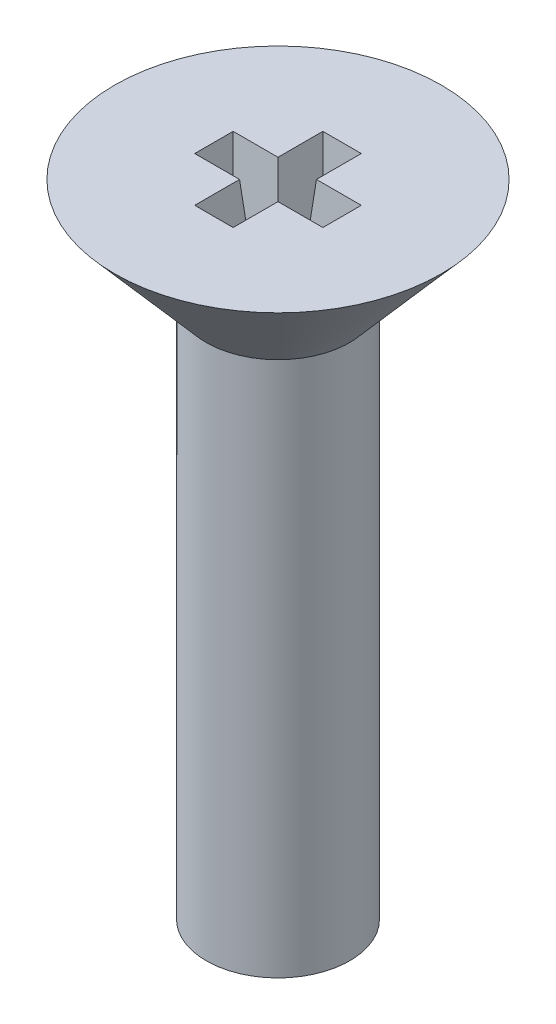
ISO-10303-21;
HEADER;
FILE_DESCRIPTION(('STEP AP214'),'2;1');
FILE_NAME('part.step','',(''),(''),'','','');
FILE_SCHEMA(('AUTOMOTIVE_DESIGN { 1 0 10303 214 1 1 1 1 }'));
ENDSEC;
DATA;
#1=APPLICATION_CONTEXT('core data for automotive mechanical design processes');
#2=APPLICATION_PROTOCOL_DEFINITION('international standard','automotive_design',2000,#1);
#3=PRODUCT_CONTEXT('',#1,'mechanical');
#4=PRODUCT('Part','Part','',(#3));
#5=PRODUCT_RELATED_PRODUCT_CATEGORY('part','',(#4));
#6=PRODUCT_DEFINITION_FORMATION('','',#4);
#7=PRODUCT_DEFINITION_CONTEXT('part definition',#1,'design');
#8=PRODUCT_DEFINITION('design','',#6,#7);
#9=PRODUCT_DEFINITION_SHAPE('','',#8);
#10=(LENGTH_UNIT() NAMED_UNIT(*) SI_UNIT(.MILLI.,.METRE.));
#11=(NAMED_UNIT(*) PLANE_ANGLE_UNIT() SI_UNIT($,.RADIAN.));
#12=(NAMED_UNIT(*) SI_UNIT($,.STERADIAN.) SOLID_ANGLE_UNIT());
#13=UNCERTAINTY_MEASURE_WITH_UNIT(LENGTH_MEASURE(1.E-05),#10,'distance_accuracy_value','');
#14=(GEOMETRIC_REPRESENTATION_CONTEXT(3) GLOBAL_UNCERTAINTY_ASSIGNED_CONTEXT((#13)) GLOBAL_UNIT_ASSIGNED_CONTEXT((#10,
#11,#12)) REPRESENTATION_CONTEXT('',''));
#15=CARTESIAN_POINT('',(0.,0.,0.));
#16=DIRECTION('',(0.,0.,1.));
#17=DIRECTION('',(1.,0.,0.));
#18=AXIS2_PLACEMENT_3D('',#15,#16,#17);
#19=CARTESIAN_POINT('',(0.,-10.6108159356459,0.));
#20=DIRECTION('',(0.,1.,0.));
#21=DIRECTION('',(-1.,0.,0.));
#22=AXIS2_PLACEMENT_3D('',#19,#20,#21);
#23=PLANE('',#22);
#24=CARTESIAN_POINT('',(0.,-10.6108159356459,0.));
#25=DIRECTION('',(0.,1.,0.));
#26=DIRECTION('',(-1.,0.,0.));
#27=AXIS2_PLACEMENT_3D('',#24,#25,#26);
#28=CIRCLE('',#27,1.4224);
#29=CARTESIAN_POINT('',(-1.4224,-10.6108159356459,0.));
#30=VERTEX_POINT('',#29);
#31=EDGE_CURVE('E11',#30,#30,#28,.T.);
#32=ORIENTED_EDGE('',*,*,#31,.F.);
#33=EDGE_LOOP('',(#32));
#34=FACE_BOUND('',#33,.T.);
#35=ADVANCED_FACE('F33',(#34),#23,.F.);
#36=CARTESIAN_POINT('',(0.,0.,0.));
#37=DIRECTION('',(0.,1.,0.));
#38=DIRECTION('',(-1.,0.,0.));
#39=AXIS2_PLACEMENT_3D('',#36,#37,#38);
#40=CYLINDRICAL_SURFACE('',#39,1.4224);
#41=CARTESIAN_POINT('',(0.,0.,0.));
#42=DIRECTION('',(0.,1.,0.));
#43=DIRECTION('',(-1.,0.,0.));
#44=AXIS2_PLACEMENT_3D('',#41,#42,#43);
#45=CIRCLE('',#44,1.4224);
#46=CARTESIAN_POINT('',(-1.4224,0.,0.));
#47=VERTEX_POINT('',#46);
#48=EDGE_CURVE('E40',#47,#47,#45,.T.);
#49=ORIENTED_EDGE('',*,*,#48,.F.);
#50=EDGE_LOOP('',(#49));
#51=FACE_BOUND('',#50,.T.);
#52=ORIENTED_EDGE('',*,*,#31,.T.);
#53=EDGE_LOOP('',(#52));
#54=FACE_BOUND('',#53,.T.);
#55=ADVANCED_FACE('F232',(#51,#54),#40,.T.);
#56=CARTESIAN_POINT('',(0.,0.,0.));
#57=DIRECTION('',(0.,1.,0.));
#58=DIRECTION('',(-1.,0.,0.));
#59=AXIS2_PLACEMENT_3D('',#56,#57,#58);
#60=CONICAL_SURFACE('',#59,1.4224,0.715584993317668);
#61=CARTESIAN_POINT('',(0.,2.0891840643541,0.));
#62=DIRECTION('',(0.,1.,0.));
#63=DIRECTION('',(-1.,0.,0.));
#64=AXIS2_PLACEMENT_3D('',#61,#62,#63);
#65=CIRCLE('',#64,3.23849999999999);
#66=CARTESIAN_POINT('',(-3.23849999999999,2.0891840643541,0.));
#67=VERTEX_POINT('',#66);
#68=EDGE_CURVE('E176',#67,#67,#65,.T.);
#69=ORIENTED_EDGE('',*,*,#68,.F.);
#70=EDGE_LOOP('',(#69));
#71=FACE_BOUND('',#70,.T.);
#72=ORIENTED_EDGE('',*,*,#48,.T.);
#73=EDGE_LOOP('',(#72));
#74=FACE_BOUND('',#73,.T.);
#75=ADVANCED_FACE('F230',(#71,#74),#60,.T.);
#76=CARTESIAN_POINT('',(3.23849999999999,2.0891840643541,0.));
#77=DIRECTION('',(0.,-1.,0.));
#78=DIRECTION('',(1.,0.,0.));
#79=AXIS2_PLACEMENT_3D('',#76,#77,#78);
#80=PLANE('',#79);
#81=DIRECTION('',(-1.,0.,0.));
#82=VECTOR('',#81,1.);
#83=CARTESIAN_POINT('',(-1.27,2.0891840643541,-0.381));
#84=LINE('',#83,#82);
#85=CARTESIAN_POINT('',(-0.381,2.0891840643541,-0.381));
#86=VERTEX_POINT('',#85);
#87=CARTESIAN_POINT('',(-1.27,2.0891840643541,-0.381));
#88=VERTEX_POINT('',#87);
#89=EDGE_CURVE('E139',#86,#88,#84,.T.);
#90=ORIENTED_EDGE('',*,*,#89,.F.);
#91=DIRECTION('',(0.,0.,1.));
#92=VECTOR('',#91,1.);
#93=CARTESIAN_POINT('',(-0.381,2.0891840643541,-0.381));
#94=LINE('',#93,#92);
#95=CARTESIAN_POINT('',(-0.381,2.0891840643541,-1.27));
#96=VERTEX_POINT('',#95);
#97=EDGE_CURVE('E47',#96,#86,#94,.T.);
#98=ORIENTED_EDGE('',*,*,#97,.F.);
#99=DIRECTION('',(-1.,0.,0.));
#100=VECTOR('',#99,1.);
#101=CARTESIAN_POINT('',(-0.381,2.0891840643541,-1.27));
#102=LINE('',#101,#100);
#103=CARTESIAN_POINT('',(0.381,2.0891840643541,-1.27));
#104=VERTEX_POINT('',#103);
#105=EDGE_CURVE('E172',#104,#96,#102,.T.);
#106=ORIENTED_EDGE('',*,*,#105,.F.);
#107=DIRECTION('',(0.,0.,-1.));
#108=VECTOR('',#107,1.);
#109=CARTESIAN_POINT('',(0.381,2.0891840643541,-1.27));
#110=LINE('',#109,#108);
#111=CARTESIAN_POINT('',(0.381,2.0891840643541,-0.381));
#112=VERTEX_POINT('',#111);
#113=EDGE_CURVE('E170',#112,#104,#110,.T.);
#114=ORIENTED_EDGE('',*,*,#113,.F.);
#115=DIRECTION('',(-1.,0.,0.));
#116=VECTOR('',#115,1.);
#117=CARTESIAN_POINT('',(0.381,2.0891840643541,-0.381));
#118=LINE('',#117,#116);
#119=CARTESIAN_POINT('',(1.27,2.0891840643541,-0.381));
#120=VERTEX_POINT('',#119);
#121=EDGE_CURVE('E167',#120,#112,#118,.T.);
#122=ORIENTED_EDGE('',*,*,#121,.F.);
#123=DIRECTION('',(0.,0.,-1.));
#124=VECTOR('',#123,1.);
#125=CARTESIAN_POINT('',(1.27,2.0891840643541,-0.381));
#126=LINE('',#125,#124);
#127=CARTESIAN_POINT('',(1.27,2.0891840643541,0.381));
#128=VERTEX_POINT('',#127);
#129=EDGE_CURVE('E164',#128,#120,#126,.T.);
#130=ORIENTED_EDGE('',*,*,#129,.F.);
#131=DIRECTION('',(1.,0.,0.));
#132=VECTOR('',#131,1.);
#133=CARTESIAN_POINT('',(1.27,2.0891840643541,0.381));
#134=LINE('',#133,#132);
#135=CARTESIAN_POINT('',(0.381,2.0891840643541,0.381));
#136=VERTEX_POINT('',#135);
#137=EDGE_CURVE('E161',#136,#128,#134,.T.);
#138=ORIENTED_EDGE('',*,*,#137,.F.);
#139=DIRECTION('',(0.,0.,-1.));
#140=VECTOR('',#139,1.);
#141=CARTESIAN_POINT('',(0.381,2.0891840643541,0.381));
#142=LINE('',#141,#140);
#143=CARTESIAN_POINT('',(0.381,2.0891840643541,1.27));
#144=VERTEX_POINT('',#143);
#145=EDGE_CURVE('E158',#144,#136,#142,.T.);
#146=ORIENTED_EDGE('',*,*,#145,.F.);
#147=DIRECTION('',(1.,0.,0.));
#148=VECTOR('',#147,1.);
#149=CARTESIAN_POINT('',(0.381,2.0891840643541,1.27));
#150=LINE('',#149,#148);
#151=CARTESIAN_POINT('',(-0.381,2.0891840643541,1.27));
#152=VERTEX_POINT('',#151);
#153=EDGE_CURVE('E155',#152,#144,#150,.T.);
#154=ORIENTED_EDGE('',*,*,#153,.F.);
#155=DIRECTION('',(0.,0.,1.));
#156=VECTOR('',#155,1.);
#157=CARTESIAN_POINT('',(-0.381,2.0891840643541,1.27));
#158=LINE('',#157,#156);
#159=CARTESIAN_POINT('',(-0.381,2.0891840643541,0.381));
#160=VERTEX_POINT('',#159);
#161=EDGE_CURVE('E149',#160,#152,#158,.T.);
#162=ORIENTED_EDGE('',*,*,#161,.F.);
#163=DIRECTION('',(1.,0.,0.));
#164=VECTOR('',#163,1.);
#165=CARTESIAN_POINT('',(-0.381,2.0891840643541,0.381));
#166=LINE('',#165,#164);
#167=CARTESIAN_POINT('',(-1.27,2.0891840643541,0.381));
#168=VERTEX_POINT('',#167);
#169=EDGE_CURVE('E147',#168,#160,#166,.T.);
#170=ORIENTED_EDGE('',*,*,#169,.F.);
#171=DIRECTION('',(0.,0.,1.));
#172=VECTOR('',#171,1.);
#173=CARTESIAN_POINT('',(-1.27,2.0891840643541,0.381));
#174=LINE('',#173,#172);
#175=EDGE_CURVE('E130',#88,#168,#174,.T.);
#176=ORIENTED_EDGE('',*,*,#175,.F.);
#177=EDGE_LOOP('',(#90,#98,#106,#114,#122,#130,#138,#146,#154,#162,#170,#176));
#178=FACE_BOUND('',#177,.T.);
#179=ORIENTED_EDGE('',*,*,#68,.T.);
#180=EDGE_LOOP('',(#179));
#181=FACE_BOUND('',#180,.T.);
#182=ADVANCED_FACE('F143',(#178,#181),#80,.F.);
#183=CARTESIAN_POINT('',(-0.381,2.0891840643541,-0.381));
#184=DIRECTION('',(-0.996194698091746,-0.0871557427476582,0.));
#185=DIRECTION('',(0.0871557427476582,-0.996194698091746,0.));
#186=AXIS2_PLACEMENT_3D('',#183,#184,#185);
#187=PLANE('',#186);
#188=ORIENTED_EDGE('',*,*,#97,.T.);
#189=DIRECTION('',(-0.0868265938642476,0.992432509138967,-0.0868265938642476));
#190=VECTOR('',#189,1.);
#191=CARTESIAN_POINT('',(-0.387702044230438,2.16578878044342,-0.387702044230438));
#192=LINE('',#191,#190);
#193=CARTESIAN_POINT('',(-0.19211197544753,-0.069815935645904,-0.19211197544753));
#194=VERTEX_POINT('',#193);
#195=EDGE_CURVE('E90',#194,#86,#192,.T.);
#196=ORIENTED_EDGE('',*,*,#195,.F.);
#197=DIRECTION('',(0.,0.,1.));
#198=VECTOR('',#197,1.);
#199=CARTESIAN_POINT('',(-0.19211197544753,-0.069815935645904,-0.381));
#200=LINE('',#199,#198);
#201=CARTESIAN_POINT('',(-0.19211197544753,-0.069815935645904,-1.08111197544753));
#202=VERTEX_POINT('',#201);
#203=EDGE_CURVE('E174',#202,#194,#200,.T.);
#204=ORIENTED_EDGE('',*,*,#203,.F.);
#205=DIRECTION('',(-0.0868265938642476,0.992432509138967,-0.0868265938642476));
#206=VECTOR('',#205,1.);
#207=CARTESIAN_POINT('',(-0.381,2.0891840643541,-1.27));
#208=LINE('',#207,#206);
#209=EDGE_CURVE('E55',#202,#96,#208,.T.);
#210=ORIENTED_EDGE('',*,*,#209,.T.);
#211=EDGE_LOOP('',(#188,#196,#204,#210));
#212=FACE_BOUND('',#211,.T.);
#213=ADVANCED_FACE('F258',(#212),#187,.F.);
#214=CARTESIAN_POINT('',(-0.381,2.0891840643541,-1.27));
#215=DIRECTION('',(0.,-0.0871557427476582,-0.996194698091745));
#216=DIRECTION('',(0.,0.996194698091746,-0.0871557427476582));
#217=AXIS2_PLACEMENT_3D('',#214,#215,#216);
#218=PLANE('',#217);
#219=ORIENTED_EDGE('',*,*,#105,.T.);
#220=ORIENTED_EDGE('',*,*,#209,.F.);
#221=DIRECTION('',(-1.,0.,0.));
#222=VECTOR('',#221,1.);
#223=CARTESIAN_POINT('',(-0.381,-0.069815935645904,-1.08111197544753));
#224=LINE('',#223,#222);
#225=CARTESIAN_POINT('',(0.19211197544753,-0.069815935645904,-1.08111197544753));
#226=VERTEX_POINT('',#225);
#227=EDGE_CURVE('E177',#226,#202,#224,.T.);
#228=ORIENTED_EDGE('',*,*,#227,.F.);
#229=DIRECTION('',(0.0868265938642476,0.992432509138967,-0.0868265938642476));
#230=VECTOR('',#229,1.);
#231=CARTESIAN_POINT('',(0.381,2.0891840643541,-1.27));
#232=LINE('',#231,#230);
#233=EDGE_CURVE('E95',#226,#104,#232,.T.);
#234=ORIENTED_EDGE('',*,*,#233,.T.);
#235=EDGE_LOOP('',(#219,#220,#228,#234));
#236=FACE_BOUND('',#235,.T.);
#237=ADVANCED_FACE('F267',(#236),#218,.F.);
#238=CARTESIAN_POINT('',(0.381,2.0891840643541,-1.27));
#239=DIRECTION('',(0.996194698091746,-0.0871557427476582,0.));
#240=DIRECTION('',(0.0871557427476582,0.996194698091746,0.));
#241=AXIS2_PLACEMENT_3D('',#238,#239,#240);
#242=PLANE('',#241);
#243=ORIENTED_EDGE('',*,*,#113,.T.);
#244=ORIENTED_EDGE('',*,*,#233,.F.);
#245=DIRECTION('',(0.,0.,-1.));
#246=VECTOR('',#245,1.);
#247=CARTESIAN_POINT('',(0.19211197544753,-0.069815935645904,-1.27));
#248=LINE('',#247,#246);
#249=CARTESIAN_POINT('',(0.19211197544753,-0.069815935645904,-0.19211197544753));
#250=VERTEX_POINT('',#249);
#251=EDGE_CURVE('E200',#250,#226,#248,.T.);
#252=ORIENTED_EDGE('',*,*,#251,.F.);
#253=DIRECTION('',(0.0868265938642476,0.992432509138967,-0.0868265938642476));
#254=VECTOR('',#253,1.);
#255=CARTESIAN_POINT('',(0.387702044230438,2.16578878044342,-0.387702044230438));
#256=LINE('',#255,#254);
#257=EDGE_CURVE('E192',#250,#112,#256,.T.);
#258=ORIENTED_EDGE('',*,*,#257,.T.);
#259=EDGE_LOOP('',(#243,#244,#252,#258));
#260=FACE_BOUND('',#259,.T.);
#261=ADVANCED_FACE('F273',(#260),#242,.F.);
#262=CARTESIAN_POINT('',(0.381,2.0891840643541,-0.381));
#263=DIRECTION('',(0.,-0.0871557427476582,-0.996194698091745));
#264=DIRECTION('',(0.,0.996194698091746,-0.0871557427476582));
#265=AXIS2_PLACEMENT_3D('',#262,#263,#264);
#266=PLANE('',#265);
#267=ORIENTED_EDGE('',*,*,#121,.T.);
#268=ORIENTED_EDGE('',*,*,#257,.F.);
#269=DIRECTION('',(-1.,0.,0.));
#270=VECTOR('',#269,1.);
#271=CARTESIAN_POINT('',(0.381,-0.069815935645904,-0.19211197544753));
#272=LINE('',#271,#270);
#273=CARTESIAN_POINT('',(1.08111197544753,-0.069815935645904,-0.19211197544753));
#274=VERTEX_POINT('',#273);
#275=EDGE_CURVE('E203',#274,#250,#272,.T.);
#276=ORIENTED_EDGE('',*,*,#275,.F.);
#277=DIRECTION('',(0.0868265938642476,0.992432509138967,-0.0868265938642476));
#278=VECTOR('',#277,1.);
#279=CARTESIAN_POINT('',(1.27,2.0891840643541,-0.381));
#280=LINE('',#279,#278);
#281=EDGE_CURVE('E190',#274,#120,#280,.T.);
#282=ORIENTED_EDGE('',*,*,#281,.T.);
#283=EDGE_LOOP('',(#267,#268,#276,#282));
#284=FACE_BOUND('',#283,.T.);
#285=ADVANCED_FACE('F280',(#284),#266,.F.);
#286=CARTESIAN_POINT('',(1.27,2.0891840643541,-0.381));
#287=DIRECTION('',(0.996194698091745,-0.0871557427476582,0.));
#288=DIRECTION('',(0.0871557427476582,0.996194698091746,0.));
#289=AXIS2_PLACEMENT_3D('',#286,#287,#288);
#290=PLANE('',#289);
#291=ORIENTED_EDGE('',*,*,#129,.T.);
#292=ORIENTED_EDGE('',*,*,#281,.F.);
#293=DIRECTION('',(0.,0.,-1.));
#294=VECTOR('',#293,1.);
#295=CARTESIAN_POINT('',(1.08111197544753,-0.069815935645904,-0.381));
#296=LINE('',#295,#294);
#297=CARTESIAN_POINT('',(1.08111197544753,-0.069815935645904,0.19211197544753));
#298=VERTEX_POINT('',#297);
#299=EDGE_CURVE('E206',#298,#274,#296,.T.);
#300=ORIENTED_EDGE('',*,*,#299,.F.);
#301=DIRECTION('',(0.0868265938642476,0.992432509138967,0.0868265938642476));
#302=VECTOR('',#301,1.);
#303=CARTESIAN_POINT('',(1.27,2.0891840643541,0.381));
#304=LINE('',#303,#302);
#305=EDGE_CURVE('E188',#298,#128,#304,.T.);
#306=ORIENTED_EDGE('',*,*,#305,.T.);
#307=EDGE_LOOP('',(#291,#292,#300,#306));
#308=FACE_BOUND('',#307,.T.);
#309=ADVANCED_FACE('F288',(#308),#290,.F.);
#310=CARTESIAN_POINT('',(1.27,2.0891840643541,0.381));
#311=DIRECTION('',(0.,-0.0871557427476582,0.996194698091745));
#312=DIRECTION('',(0.,-0.996194698091746,-0.0871557427476582));
#313=AXIS2_PLACEMENT_3D('',#310,#311,#312);
#314=PLANE('',#313);
#315=ORIENTED_EDGE('',*,*,#137,.T.);
#316=ORIENTED_EDGE('',*,*,#305,.F.);
#317=DIRECTION('',(1.,0.,0.));
#318=VECTOR('',#317,1.);
#319=CARTESIAN_POINT('',(1.27,-0.069815935645904,0.19211197544753));
#320=LINE('',#319,#318);
#321=CARTESIAN_POINT('',(0.19211197544753,-0.069815935645904,0.19211197544753));
#322=VERTEX_POINT('',#321);
#323=EDGE_CURVE('E209',#322,#298,#320,.T.);
#324=ORIENTED_EDGE('',*,*,#323,.F.);
#325=DIRECTION('',(0.0868265938642476,0.992432509138967,0.0868265938642476));
#326=VECTOR('',#325,1.);
#327=CARTESIAN_POINT('',(0.387702044230438,2.16578878044342,0.387702044230438));
#328=LINE('',#327,#326);
#329=EDGE_CURVE('E186',#322,#136,#328,.T.);
#330=ORIENTED_EDGE('',*,*,#329,.T.);
#331=EDGE_LOOP('',(#315,#316,#324,#330));
#332=FACE_BOUND('',#331,.T.);
#333=ADVANCED_FACE('F296',(#332),#314,.F.);
#334=CARTESIAN_POINT('',(0.381,2.0891840643541,0.381));
#335=DIRECTION('',(0.996194698091746,-0.0871557427476582,0.));
#336=DIRECTION('',(0.0871557427476582,0.996194698091746,0.));
#337=AXIS2_PLACEMENT_3D('',#334,#335,#336);
#338=PLANE('',#337);
#339=ORIENTED_EDGE('',*,*,#145,.T.);
#340=ORIENTED_EDGE('',*,*,#329,.F.);
#341=DIRECTION('',(0.,0.,-1.));
#342=VECTOR('',#341,1.);
#343=CARTESIAN_POINT('',(0.19211197544753,-0.069815935645904,0.381));
#344=LINE('',#343,#342);
#345=CARTESIAN_POINT('',(0.19211197544753,-0.069815935645904,1.08111197544753));
#346=VERTEX_POINT('',#345);
#347=EDGE_CURVE('E212',#346,#322,#344,.T.);
#348=ORIENTED_EDGE('',*,*,#347,.F.);
#349=DIRECTION('',(0.0868265938642476,0.992432509138967,0.0868265938642476));
#350=VECTOR('',#349,1.);
#351=CARTESIAN_POINT('',(0.381,2.0891840643541,1.27));
#352=LINE('',#351,#350);
#353=EDGE_CURVE('E184',#346,#144,#352,.T.);
#354=ORIENTED_EDGE('',*,*,#353,.T.);
#355=EDGE_LOOP('',(#339,#340,#348,#354));
#356=FACE_BOUND('',#355,.T.);
#357=ADVANCED_FACE('F304',(#356),#338,.F.);
#358=CARTESIAN_POINT('',(0.381,2.0891840643541,1.27));
#359=DIRECTION('',(0.,-0.0871557427476582,0.996194698091745));
#360=DIRECTION('',(0.,-0.996194698091746,-0.0871557427476582));
#361=AXIS2_PLACEMENT_3D('',#358,#359,#360);
#362=PLANE('',#361);
#363=ORIENTED_EDGE('',*,*,#153,.T.);
#364=ORIENTED_EDGE('',*,*,#353,.F.);
#365=DIRECTION('',(1.,0.,0.));
#366=VECTOR('',#365,1.);
#367=CARTESIAN_POINT('',(0.381,-0.069815935645904,1.08111197544753));
#368=LINE('',#367,#366);
#369=CARTESIAN_POINT('',(-0.19211197544753,-0.069815935645904,1.08111197544753));
#370=VERTEX_POINT('',#369);
#371=EDGE_CURVE('E215',#370,#346,#368,.T.);
#372=ORIENTED_EDGE('',*,*,#371,.F.);
#373=DIRECTION('',(-0.0868265938642476,0.992432509138967,0.0868265938642476));
#374=VECTOR('',#373,1.);
#375=CARTESIAN_POINT('',(-0.381,2.0891840643541,1.27));
#376=LINE('',#375,#374);
#377=EDGE_CURVE('E182',#370,#152,#376,.T.);
#378=ORIENTED_EDGE('',*,*,#377,.T.);
#379=EDGE_LOOP('',(#363,#364,#372,#378));
#380=FACE_BOUND('',#379,.T.);
#381=ADVANCED_FACE('F312',(#380),#362,.F.);
#382=CARTESIAN_POINT('',(-0.381,2.0891840643541,1.27));
#383=DIRECTION('',(-0.996194698091746,-0.0871557427476582,0.));
#384=DIRECTION('',(0.0871557427476582,-0.996194698091746,0.));
#385=AXIS2_PLACEMENT_3D('',#382,#383,#384);
#386=PLANE('',#385);
#387=ORIENTED_EDGE('',*,*,#161,.T.);
#388=ORIENTED_EDGE('',*,*,#377,.F.);
#389=DIRECTION('',(0.,0.,1.));
#390=VECTOR('',#389,1.);
#391=CARTESIAN_POINT('',(-0.19211197544753,-0.069815935645904,1.27));
#392=LINE('',#391,#390);
#393=CARTESIAN_POINT('',(-0.19211197544753,-0.069815935645904,0.19211197544753));
#394=VERTEX_POINT('',#393);
#395=EDGE_CURVE('E218',#394,#370,#392,.T.);
#396=ORIENTED_EDGE('',*,*,#395,.F.);
#397=DIRECTION('',(-0.0868265938642477,0.992432509138967,0.0868265938642476));
#398=VECTOR('',#397,1.);
#399=CARTESIAN_POINT('',(-0.387702044230438,2.16578878044342,0.387702044230438));
#400=LINE('',#399,#398);
#401=EDGE_CURVE('E180',#394,#160,#400,.T.);
#402=ORIENTED_EDGE('',*,*,#401,.T.);
#403=EDGE_LOOP('',(#387,#388,#396,#402));
#404=FACE_BOUND('',#403,.T.);
#405=ADVANCED_FACE('F320',(#404),#386,.F.);
#406=CARTESIAN_POINT('',(-0.381,2.0891840643541,0.381));
#407=DIRECTION('',(0.,-0.0871557427476582,0.996194698091746));
#408=DIRECTION('',(0.,-0.996194698091746,-0.0871557427476582));
#409=AXIS2_PLACEMENT_3D('',#406,#407,#408);
#410=PLANE('',#409);
#411=ORIENTED_EDGE('',*,*,#169,.T.);
#412=ORIENTED_EDGE('',*,*,#401,.F.);
#413=DIRECTION('',(1.,0.,0.));
#414=VECTOR('',#413,1.);
#415=CARTESIAN_POINT('',(-0.381,-0.069815935645904,0.19211197544753));
#416=LINE('',#415,#414);
#417=CARTESIAN_POINT('',(-1.08111197544753,-0.069815935645904,0.19211197544753));
#418=VERTEX_POINT('',#417);
#419=EDGE_CURVE('E221',#418,#394,#416,.T.);
#420=ORIENTED_EDGE('',*,*,#419,.F.);
#421=DIRECTION('',(-0.0868265938642476,0.992432509138967,0.0868265938642476));
#422=VECTOR('',#421,1.);
#423=CARTESIAN_POINT('',(-1.27,2.0891840643541,0.381));
#424=LINE('',#423,#422);
#425=EDGE_CURVE('E136',#418,#168,#424,.T.);
#426=ORIENTED_EDGE('',*,*,#425,.T.);
#427=EDGE_LOOP('',(#411,#412,#420,#426));
#428=FACE_BOUND('',#427,.T.);
#429=ADVANCED_FACE('F328',(#428),#410,.F.);
#430=CARTESIAN_POINT('',(-1.27,2.0891840643541,0.381));
#431=DIRECTION('',(-0.996194698091745,-0.0871557427476582,0.));
#432=DIRECTION('',(0.0871557427476582,-0.996194698091746,0.));
#433=AXIS2_PLACEMENT_3D('',#430,#431,#432);
#434=PLANE('',#433);
#435=ORIENTED_EDGE('',*,*,#175,.T.);
#436=ORIENTED_EDGE('',*,*,#425,.F.);
#437=DIRECTION('',(0.,0.,1.));
#438=VECTOR('',#437,1.);
#439=CARTESIAN_POINT('',(-1.08111197544753,-0.069815935645904,0.381));
#440=LINE('',#439,#438);
#441=CARTESIAN_POINT('',(-1.08111197544753,-0.069815935645904,-0.19211197544753));
#442=VERTEX_POINT('',#441);
#443=EDGE_CURVE('E133',#442,#418,#440,.T.);
#444=ORIENTED_EDGE('',*,*,#443,.F.);
#445=DIRECTION('',(-0.0868265938642476,0.992432509138967,-0.0868265938642476));
#446=VECTOR('',#445,1.);
#447=CARTESIAN_POINT('',(-1.27,2.0891840643541,-0.381));
#448=LINE('',#447,#446);
#449=EDGE_CURVE('E126',#442,#88,#448,.T.);
#450=ORIENTED_EDGE('',*,*,#449,.T.);
#451=EDGE_LOOP('',(#435,#436,#444,#450));
#452=FACE_BOUND('',#451,.T.);
#453=ADVANCED_FACE('F128',(#452),#434,.F.);
#454=CARTESIAN_POINT('',(-1.27,2.0891840643541,-0.381));
#455=DIRECTION('',(0.,-0.0871557427476582,-0.996194698091746));
#456=DIRECTION('',(0.,0.996194698091746,-0.0871557427476582));
#457=AXIS2_PLACEMENT_3D('',#454,#455,#456);
#458=PLANE('',#457);
#459=ORIENTED_EDGE('',*,*,#89,.T.);
#460=ORIENTED_EDGE('',*,*,#449,.F.);
#461=DIRECTION('',(-1.,0.,0.));
#462=VECTOR('',#461,1.);
#463=CARTESIAN_POINT('',(-1.27,-0.069815935645904,-0.19211197544753));
#464=LINE('',#463,#462);
#465=EDGE_CURVE('E197',#194,#442,#464,.T.);
#466=ORIENTED_EDGE('',*,*,#465,.F.);
#467=ORIENTED_EDGE('',*,*,#195,.T.);
#468=EDGE_LOOP('',(#459,#460,#466,#467));
#469=FACE_BOUND('',#468,.T.);
#470=ADVANCED_FACE('F140',(#469),#458,.F.);
#471=CARTESIAN_POINT('',(0.,-0.069815935645904,0.));
#472=DIRECTION('',(0.,-1.,0.));
#473=DIRECTION('',(0.,0.,-1.));
#474=AXIS2_PLACEMENT_3D('',#471,#472,#473);
#475=PLANE('',#474);
#476=ORIENTED_EDGE('',*,*,#203,.T.);
#477=ORIENTED_EDGE('',*,*,#465,.T.);
#478=ORIENTED_EDGE('',*,*,#443,.T.);
#479=ORIENTED_EDGE('',*,*,#419,.T.);
#480=ORIENTED_EDGE('',*,*,#395,.T.);
#481=ORIENTED_EDGE('',*,*,#371,.T.);
#482=ORIENTED_EDGE('',*,*,#347,.T.);
#483=ORIENTED_EDGE('',*,*,#323,.T.);
#484=ORIENTED_EDGE('',*,*,#299,.T.);
#485=ORIENTED_EDGE('',*,*,#275,.T.);
#486=ORIENTED_EDGE('',*,*,#251,.T.);
#487=ORIENTED_EDGE('',*,*,#227,.T.);
#488=EDGE_LOOP('',(#476,#477,#478,#479,#480,#481,#482,#483,#484,#485,#486,#487));
#489=FACE_BOUND('',#488,.T.);
#490=ADVANCED_FACE('F349',(#489),#475,.F.);
#491=CLOSED_SHELL('',(#35,#55,#75,#182,#213,#237,#261,#285,#309,#333,#357,#381,#405,#429,#453,
#470,#490));
#492=MANIFOLD_SOLID_BREP('B2',#491);
#493=ADVANCED_BREP_SHAPE_REPRESENTATION('',(#18,#492),#14);
#494=SHAPE_DEFINITION_REPRESENTATION(#9,#493);
ENDSEC;
END-ISO-10303-21;
